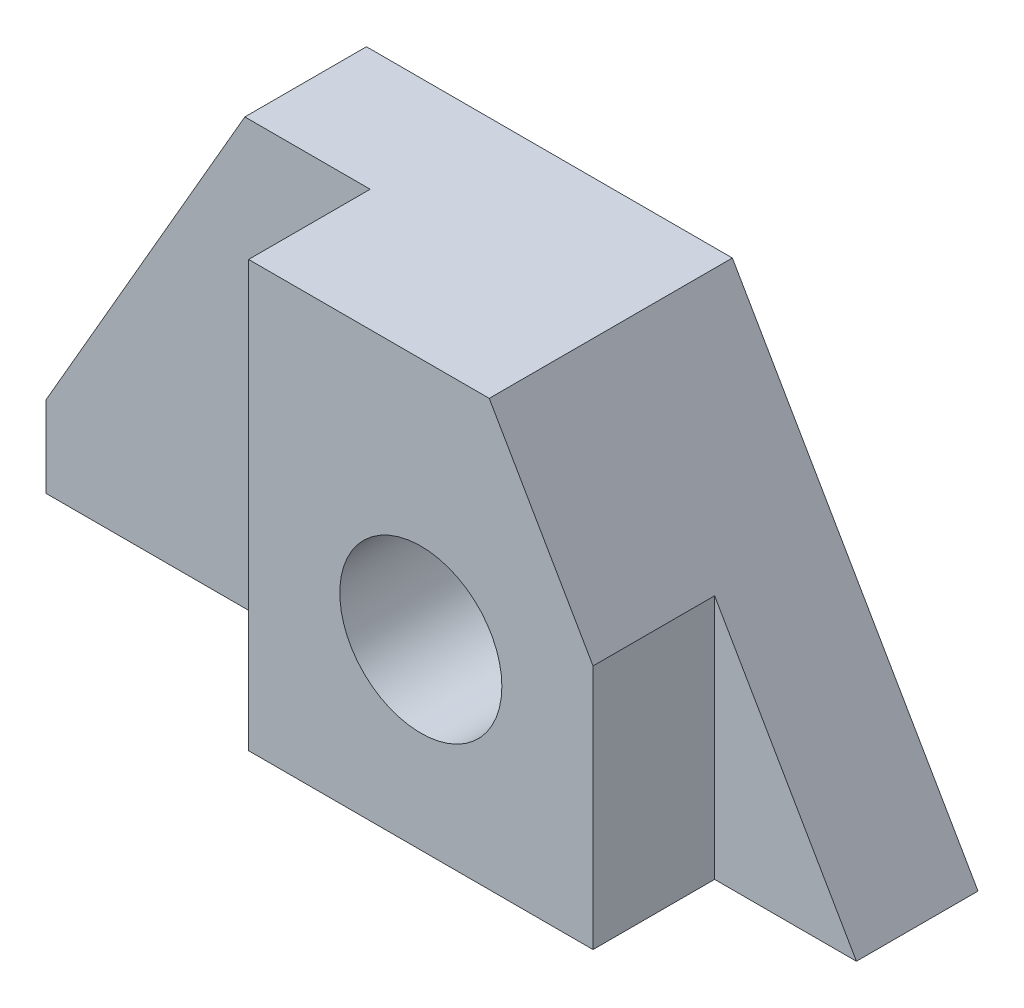
ISO-10303-21;
HEADER;
FILE_DESCRIPTION(('STEP AP214'),'2;1');
FILE_NAME('part.step','',(''),(''),'','','');
FILE_SCHEMA(('AUTOMOTIVE_DESIGN { 1 0 10303 214 1 1 1 1 }'));
ENDSEC;
DATA;
#1=APPLICATION_CONTEXT('core data for automotive mechanical design processes');
#2=APPLICATION_PROTOCOL_DEFINITION('international standard','automotive_design',2000,#1);
#3=PRODUCT_CONTEXT('',#1,'mechanical');
#4=PRODUCT('Part','Part','',(#3));
#5=PRODUCT_RELATED_PRODUCT_CATEGORY('part','',(#4));
#6=PRODUCT_DEFINITION_FORMATION('','',#4);
#7=PRODUCT_DEFINITION_CONTEXT('part definition',#1,'design');
#8=PRODUCT_DEFINITION('design','',#6,#7);
#9=PRODUCT_DEFINITION_SHAPE('','',#8);
#10=(LENGTH_UNIT() NAMED_UNIT(*) SI_UNIT(.MILLI.,.METRE.));
#11=(NAMED_UNIT(*) PLANE_ANGLE_UNIT() SI_UNIT($,.RADIAN.));
#12=(NAMED_UNIT(*) SI_UNIT($,.STERADIAN.) SOLID_ANGLE_UNIT());
#13=UNCERTAINTY_MEASURE_WITH_UNIT(LENGTH_MEASURE(1.E-05),#10,'distance_accuracy_value','');
#14=(GEOMETRIC_REPRESENTATION_CONTEXT(3) GLOBAL_UNCERTAINTY_ASSIGNED_CONTEXT((#13)) GLOBAL_UNIT_ASSIGNED_CONTEXT((#10,
#11,#12)) REPRESENTATION_CONTEXT('',''));
#15=CARTESIAN_POINT('',(0.,0.,0.));
#16=DIRECTION('',(0.,0.,1.));
#17=DIRECTION('',(1.,0.,0.));
#18=AXIS2_PLACEMENT_3D('',#15,#16,#17);
#19=CARTESIAN_POINT('',(0.,66.675,19.05));
#20=DIRECTION('',(0.,-1.,0.));
#21=DIRECTION('',(0.,0.,-1.));
#22=AXIS2_PLACEMENT_3D('',#19,#20,#21);
#23=PLANE('',#22);
#24=DIRECTION('',(-1.,0.,0.));
#25=VECTOR('',#24,1.);
#26=CARTESIAN_POINT('',(0.,66.675,0.));
#27=LINE('',#26,#25);
#28=CARTESIAN_POINT('',(-0.79606103391627,66.675,0.));
#29=VERTEX_POINT('',#28);
#30=CARTESIAN_POINT('',(-58.1387510561882,66.675,0.));
#31=VERTEX_POINT('',#30);
#32=EDGE_CURVE('E196',#29,#31,#27,.T.);
#33=ORIENTED_EDGE('',*,*,#32,.T.);
#34=DIRECTION('',(0.,0.,-1.));
#35=VECTOR('',#34,1.);
#36=CARTESIAN_POINT('',(-58.1387510561882,66.675,19.05));
#37=LINE('',#36,#35);
#38=CARTESIAN_POINT('',(-58.1387510561882,66.675,19.05));
#39=VERTEX_POINT('',#38);
#40=EDGE_CURVE('E11',#39,#31,#37,.T.);
#41=ORIENTED_EDGE('',*,*,#40,.F.);
#42=DIRECTION('',(-1.,0.,0.));
#43=VECTOR('',#42,1.);
#44=CARTESIAN_POINT('',(0.,66.675,19.05));
#45=LINE('',#44,#43);
#46=CARTESIAN_POINT('',(-38.5012318356978,66.675,19.05));
#47=VERTEX_POINT('',#46);
#48=EDGE_CURVE('E95',#47,#39,#45,.T.);
#49=ORIENTED_EDGE('',*,*,#48,.F.);
#50=DIRECTION('',(0.,0.,-1.));
#51=VECTOR('',#50,1.);
#52=CARTESIAN_POINT('',(-38.5012318356978,66.675,38.1));
#53=LINE('',#52,#51);
#54=CARTESIAN_POINT('',(-38.5012318356978,66.675,38.1));
#55=VERTEX_POINT('',#54);
#56=EDGE_CURVE('E185',#55,#47,#53,.T.);
#57=ORIENTED_EDGE('',*,*,#56,.F.);
#58=DIRECTION('',(-1.,0.,0.));
#59=VECTOR('',#58,1.);
#60=CARTESIAN_POINT('',(0.,66.675,38.1));
#61=LINE('',#60,#59);
#62=CARTESIAN_POINT('',(-0.79606103391627,66.675,38.1));
#63=VERTEX_POINT('',#62);
#64=EDGE_CURVE('E166',#63,#55,#61,.T.);
#65=ORIENTED_EDGE('',*,*,#64,.F.);
#66=DIRECTION('',(0.,0.,-1.));
#67=VECTOR('',#66,1.);
#68=CARTESIAN_POINT('',(-0.79606103391627,66.675,38.1));
#69=LINE('',#68,#67);
#70=EDGE_CURVE('E189',#63,#29,#69,.T.);
#71=ORIENTED_EDGE('',*,*,#70,.T.);
#72=EDGE_LOOP('',(#33,#41,#49,#57,#65,#71));
#73=FACE_BOUND('',#72,.T.);
#74=ADVANCED_FACE('F45',(#73),#23,.F.);
#75=CARTESIAN_POINT('',(-72.475185190805,41.8435676794787,19.05));
#76=DIRECTION('',(0.866025403784442,-0.499999999999995,0.));
#77=DIRECTION('',(0.499999999999995,0.866025403784442,0.));
#78=AXIS2_PLACEMENT_3D('',#75,#76,#77);
#79=PLANE('',#78);
#80=DIRECTION('',(-0.499999999999995,-0.866025403784442,0.));
#81=VECTOR('',#80,1.);
#82=CARTESIAN_POINT('',(-72.475185190805,41.8435676794787,0.));
#83=LINE('',#82,#81);
#84=CARTESIAN_POINT('',(-89.3012318356978,12.7,0.));
#85=VERTEX_POINT('',#84);
#86=EDGE_CURVE('E215',#31,#85,#83,.T.);
#87=ORIENTED_EDGE('',*,*,#86,.T.);
#88=DIRECTION('',(0.,0.,-1.));
#89=VECTOR('',#88,1.);
#90=CARTESIAN_POINT('',(-89.3012318356978,12.7,19.05));
#91=LINE('',#90,#89);
#92=CARTESIAN_POINT('',(-89.3012318356978,12.7,19.05));
#93=VERTEX_POINT('',#92);
#94=EDGE_CURVE('E53',#93,#85,#91,.T.);
#95=ORIENTED_EDGE('',*,*,#94,.F.);
#96=DIRECTION('',(-0.499999999999995,-0.866025403784442,0.));
#97=VECTOR('',#96,1.);
#98=CARTESIAN_POINT('',(-72.475185190805,41.8435676794787,19.05));
#99=LINE('',#98,#97);
#100=EDGE_CURVE('E204',#39,#93,#99,.T.);
#101=ORIENTED_EDGE('',*,*,#100,.F.);
#102=ORIENTED_EDGE('',*,*,#40,.T.);
#103=EDGE_LOOP('',(#87,#95,#101,#102));
#104=FACE_BOUND('',#103,.T.);
#105=ADVANCED_FACE('F245',(#104),#79,.F.);
#106=CARTESIAN_POINT('',(-89.3012318356978,0.,19.05));
#107=DIRECTION('',(1.,0.,0.));
#108=DIRECTION('',(0.,0.,-1.));
#109=AXIS2_PLACEMENT_3D('',#106,#107,#108);
#110=PLANE('',#109);
#111=DIRECTION('',(0.,-1.,0.));
#112=VECTOR('',#111,1.);
#113=CARTESIAN_POINT('',(-89.3012318356978,0.,0.));
#114=LINE('',#113,#112);
#115=CARTESIAN_POINT('',(-89.3012318356978,0.,0.));
#116=VERTEX_POINT('',#115);
#117=EDGE_CURVE('E87',#85,#116,#114,.T.);
#118=ORIENTED_EDGE('',*,*,#117,.T.);
#119=DIRECTION('',(0.,0.,-1.));
#120=VECTOR('',#119,1.);
#121=CARTESIAN_POINT('',(-89.3012318356978,0.,19.05));
#122=LINE('',#121,#120);
#123=CARTESIAN_POINT('',(-89.3012318356978,0.,19.05));
#124=VERTEX_POINT('',#123);
#125=EDGE_CURVE('E212',#124,#116,#122,.T.);
#126=ORIENTED_EDGE('',*,*,#125,.F.);
#127=DIRECTION('',(0.,-1.,0.));
#128=VECTOR('',#127,1.);
#129=CARTESIAN_POINT('',(-89.3012318356978,0.,19.05));
#130=LINE('',#129,#128);
#131=EDGE_CURVE('E69',#93,#124,#130,.T.);
#132=ORIENTED_EDGE('',*,*,#131,.F.);
#133=ORIENTED_EDGE('',*,*,#94,.T.);
#134=EDGE_LOOP('',(#118,#126,#132,#133));
#135=FACE_BOUND('',#134,.T.);
#136=ADVANCED_FACE('F225',(#135),#110,.F.);
#137=CARTESIAN_POINT('',(0.,0.,19.05));
#138=DIRECTION('',(0.,1.,0.));
#139=DIRECTION('',(0.,0.,1.));
#140=AXIS2_PLACEMENT_3D('',#137,#138,#139);
#141=PLANE('',#140);
#142=DIRECTION('',(1.,0.,0.));
#143=VECTOR('',#142,1.);
#144=CARTESIAN_POINT('',(0.,0.,0.));
#145=LINE('',#144,#143);
#146=CARTESIAN_POINT('',(37.6987681643022,0.,0.));
#147=VERTEX_POINT('',#146);
#148=EDGE_CURVE('E201',#116,#147,#145,.T.);
#149=ORIENTED_EDGE('',*,*,#148,.T.);
#150=DIRECTION('',(0.,0.,-1.));
#151=VECTOR('',#150,1.);
#152=CARTESIAN_POINT('',(37.6987681643022,0.,19.05));
#153=LINE('',#152,#151);
#154=CARTESIAN_POINT('',(37.6987681643022,0.,19.05));
#155=VERTEX_POINT('',#154);
#156=EDGE_CURVE('E147',#155,#147,#153,.T.);
#157=ORIENTED_EDGE('',*,*,#156,.F.);
#158=DIRECTION('',(1.,0.,0.));
#159=VECTOR('',#158,1.);
#160=CARTESIAN_POINT('',(0.,0.,19.05));
#161=LINE('',#160,#159);
#162=CARTESIAN_POINT('',(15.4737681643022,0.,19.05));
#163=VERTEX_POINT('',#162);
#164=EDGE_CURVE('E138',#163,#155,#161,.T.);
#165=ORIENTED_EDGE('',*,*,#164,.F.);
#166=DIRECTION('',(0.,0.,-1.));
#167=VECTOR('',#166,1.);
#168=CARTESIAN_POINT('',(15.4737681643022,0.,38.1));
#169=LINE('',#168,#167);
#170=CARTESIAN_POINT('',(15.4737681643022,0.,38.1));
#171=VERTEX_POINT('',#170);
#172=EDGE_CURVE('E125',#171,#163,#169,.T.);
#173=ORIENTED_EDGE('',*,*,#172,.F.);
#174=DIRECTION('',(1.,0.,0.));
#175=VECTOR('',#174,1.);
#176=CARTESIAN_POINT('',(0.,0.,38.1));
#177=LINE('',#176,#175);
#178=CARTESIAN_POINT('',(-38.5012318356978,0.,38.1));
#179=VERTEX_POINT('',#178);
#180=EDGE_CURVE('E133',#179,#171,#177,.T.);
#181=ORIENTED_EDGE('',*,*,#180,.F.);
#182=DIRECTION('',(0.,0.,-1.));
#183=VECTOR('',#182,1.);
#184=CARTESIAN_POINT('',(-38.5012318356978,0.,38.1));
#185=LINE('',#184,#183);
#186=CARTESIAN_POINT('',(-38.5012318356978,0.,19.05));
#187=VERTEX_POINT('',#186);
#188=EDGE_CURVE('E132',#179,#187,#185,.T.);
#189=ORIENTED_EDGE('',*,*,#188,.T.);
#190=DIRECTION('',(1.,0.,0.));
#191=VECTOR('',#190,1.);
#192=CARTESIAN_POINT('',(0.,0.,19.05));
#193=LINE('',#192,#191);
#194=EDGE_CURVE('E209',#124,#187,#193,.T.);
#195=ORIENTED_EDGE('',*,*,#194,.F.);
#196=ORIENTED_EDGE('',*,*,#125,.T.);
#197=EDGE_LOOP('',(#149,#157,#165,#173,#181,#189,#195,#196));
#198=FACE_BOUND('',#197,.T.);
#199=ADVANCED_FACE('F145',(#198),#141,.F.);
#200=CARTESIAN_POINT('',(0.,0.,19.05));
#201=DIRECTION('',(0.,0.,1.));
#202=DIRECTION('',(1.,0.,0.));
#203=AXIS2_PLACEMENT_3D('',#200,#201,#202);
#204=PLANE('',#203);
#205=DIRECTION('',(0.,-1.,0.));
#206=VECTOR('',#205,1.);
#207=CARTESIAN_POINT('',(-38.5012318356978,0.,19.05));
#208=LINE('',#207,#206);
#209=EDGE_CURVE('E197',#47,#187,#208,.T.);
#210=ORIENTED_EDGE('',*,*,#209,.F.);
#211=ORIENTED_EDGE('',*,*,#48,.T.);
#212=ORIENTED_EDGE('',*,*,#100,.T.);
#213=ORIENTED_EDGE('',*,*,#131,.T.);
#214=ORIENTED_EDGE('',*,*,#194,.T.);
#215=EDGE_LOOP('',(#210,#211,#212,#213,#214));
#216=FACE_BOUND('',#215,.T.);
#217=ADVANCED_FACE('F244',(#216),#204,.T.);
#218=CARTESIAN_POINT('',(0.,0.,0.));
#219=DIRECTION('',(0.,0.,1.));
#220=DIRECTION('',(1.,0.,0.));
#221=AXIS2_PLACEMENT_3D('',#218,#219,#220);
#222=PLANE('',#221);
#223=ORIENTED_EDGE('',*,*,#32,.F.);
#224=DIRECTION('',(-0.500000000000001,0.866025403784438,0.));
#225=VECTOR('',#224,1.);
#226=CARTESIAN_POINT('',(28.2740761232266,16.3240454608329,0.));
#227=LINE('',#226,#225);
#228=EDGE_CURVE('E159',#147,#29,#227,.T.);
#229=ORIENTED_EDGE('',*,*,#228,.F.);
#230=ORIENTED_EDGE('',*,*,#148,.F.);
#231=ORIENTED_EDGE('',*,*,#117,.F.);
#232=ORIENTED_EDGE('',*,*,#86,.F.);
#233=EDGE_LOOP('',(#223,#229,#230,#231,#232));
#234=FACE_BOUND('',#233,.T.);
#235=CARTESIAN_POINT('',(-11.5137318356978,28.575,0.));
#236=DIRECTION('',(0.,0.,1.));
#237=DIRECTION('',(1.,0.,0.));
#238=AXIS2_PLACEMENT_3D('',#235,#236,#237);
#239=CIRCLE('',#238,12.7);
#240=CARTESIAN_POINT('',(1.18626816430217,28.575,0.));
#241=VERTEX_POINT('',#240);
#242=EDGE_CURVE('E151',#241,#241,#239,.T.);
#243=ORIENTED_EDGE('',*,*,#242,.T.);
#244=EDGE_LOOP('',(#243));
#245=FACE_BOUND('',#244,.T.);
#246=ADVANCED_FACE('F231',(#234,#245),#222,.F.);
#247=CARTESIAN_POINT('',(-38.5012318356978,0.,38.1));
#248=DIRECTION('',(1.,0.,0.));
#249=DIRECTION('',(0.,1.,0.));
#250=AXIS2_PLACEMENT_3D('',#247,#248,#249);
#251=PLANE('',#250);
#252=ORIENTED_EDGE('',*,*,#56,.T.);
#253=ORIENTED_EDGE('',*,*,#209,.T.);
#254=ORIENTED_EDGE('',*,*,#188,.F.);
#255=DIRECTION('',(0.,-1.,0.));
#256=VECTOR('',#255,1.);
#257=CARTESIAN_POINT('',(-38.5012318356978,0.,38.1));
#258=LINE('',#257,#256);
#259=EDGE_CURVE('E170',#55,#179,#258,.T.);
#260=ORIENTED_EDGE('',*,*,#259,.F.);
#261=EDGE_LOOP('',(#252,#253,#254,#260));
#262=FACE_BOUND('',#261,.T.);
#263=ADVANCED_FACE('F243',(#262),#251,.F.);
#264=CARTESIAN_POINT('',(15.4737681643022,0.,38.1));
#265=DIRECTION('',(1.,0.,0.));
#266=DIRECTION('',(0.,0.,-1.));
#267=AXIS2_PLACEMENT_3D('',#264,#265,#266);
#268=PLANE('',#267);
#269=DIRECTION('',(0.,-1.,0.));
#270=VECTOR('',#269,1.);
#271=CARTESIAN_POINT('',(15.4737681643022,0.,19.05));
#272=LINE('',#271,#270);
#273=CARTESIAN_POINT('',(15.4737681643022,38.4948291982182,19.05));
#274=VERTEX_POINT('',#273);
#275=EDGE_CURVE('E60',#274,#163,#272,.T.);
#276=ORIENTED_EDGE('',*,*,#275,.F.);
#277=DIRECTION('',(0.,0.,-1.));
#278=VECTOR('',#277,1.);
#279=CARTESIAN_POINT('',(15.4737681643022,38.4948291982182,38.1));
#280=LINE('',#279,#278);
#281=CARTESIAN_POINT('',(15.4737681643022,38.4948291982182,38.1));
#282=VERTEX_POINT('',#281);
#283=EDGE_CURVE('E193',#282,#274,#280,.T.);
#284=ORIENTED_EDGE('',*,*,#283,.F.);
#285=DIRECTION('',(0.,-1.,0.));
#286=VECTOR('',#285,1.);
#287=CARTESIAN_POINT('',(15.4737681643022,0.,38.1));
#288=LINE('',#287,#286);
#289=EDGE_CURVE('E128',#282,#171,#288,.T.);
#290=ORIENTED_EDGE('',*,*,#289,.T.);
#291=ORIENTED_EDGE('',*,*,#172,.T.);
#292=EDGE_LOOP('',(#276,#284,#290,#291));
#293=FACE_BOUND('',#292,.T.);
#294=ADVANCED_FACE('F126',(#293),#268,.T.);
#295=CARTESIAN_POINT('',(28.2740761232266,16.3240454608329,38.1));
#296=DIRECTION('',(-0.866025403784438,-0.500000000000001,0.));
#297=DIRECTION('',(0.500000000000001,-0.866025403784438,0.));
#298=AXIS2_PLACEMENT_3D('',#295,#296,#297);
#299=PLANE('',#298);
#300=ORIENTED_EDGE('',*,*,#228,.T.);
#301=ORIENTED_EDGE('',*,*,#70,.F.);
#302=DIRECTION('',(-0.500000000000001,0.866025403784438,0.));
#303=VECTOR('',#302,1.);
#304=CARTESIAN_POINT('',(28.2740761232266,16.3240454608329,38.1));
#305=LINE('',#304,#303);
#306=EDGE_CURVE('E162',#282,#63,#305,.T.);
#307=ORIENTED_EDGE('',*,*,#306,.F.);
#308=ORIENTED_EDGE('',*,*,#283,.T.);
#309=DIRECTION('',(-0.500000000000001,0.866025403784438,0.));
#310=VECTOR('',#309,1.);
#311=CARTESIAN_POINT('',(28.2740761232266,16.3240454608329,19.05));
#312=LINE('',#311,#310);
#313=EDGE_CURVE('E141',#155,#274,#312,.T.);
#314=ORIENTED_EDGE('',*,*,#313,.F.);
#315=ORIENTED_EDGE('',*,*,#156,.T.);
#316=EDGE_LOOP('',(#300,#301,#307,#308,#314,#315));
#317=FACE_BOUND('',#316,.T.);
#318=ADVANCED_FACE('F235',(#317),#299,.F.);
#319=CARTESIAN_POINT('',(-11.5137318356978,28.575,38.1));
#320=DIRECTION('',(0.,0.,-1.));
#321=DIRECTION('',(-1.,0.,0.));
#322=AXIS2_PLACEMENT_3D('',#319,#320,#321);
#323=CYLINDRICAL_SURFACE('',#322,12.7);
#324=CARTESIAN_POINT('',(-11.5137318356978,28.575,38.1));
#325=DIRECTION('',(0.,0.,1.));
#326=DIRECTION('',(1.,0.,0.));
#327=AXIS2_PLACEMENT_3D('',#324,#325,#326);
#328=CIRCLE('',#327,12.7);
#329=CARTESIAN_POINT('',(1.18626816430217,28.575,38.1));
#330=VERTEX_POINT('',#329);
#331=EDGE_CURVE('E155',#330,#330,#328,.T.);
#332=ORIENTED_EDGE('',*,*,#331,.T.);
#333=EDGE_LOOP('',(#332));
#334=FACE_BOUND('',#333,.T.);
#335=ORIENTED_EDGE('',*,*,#242,.F.);
#336=EDGE_LOOP('',(#335));
#337=FACE_BOUND('',#336,.T.);
#338=ADVANCED_FACE('F259',(#334,#337),#323,.F.);
#339=CARTESIAN_POINT('',(0.,0.,38.1));
#340=DIRECTION('',(0.,0.,1.));
#341=DIRECTION('',(1.,0.,0.));
#342=AXIS2_PLACEMENT_3D('',#339,#340,#341);
#343=PLANE('',#342);
#344=ORIENTED_EDGE('',*,*,#331,.F.);
#345=EDGE_LOOP('',(#344));
#346=FACE_BOUND('',#345,.T.);
#347=ORIENTED_EDGE('',*,*,#289,.F.);
#348=ORIENTED_EDGE('',*,*,#306,.T.);
#349=ORIENTED_EDGE('',*,*,#64,.T.);
#350=ORIENTED_EDGE('',*,*,#259,.T.);
#351=ORIENTED_EDGE('',*,*,#180,.T.);
#352=EDGE_LOOP('',(#347,#348,#349,#350,#351));
#353=FACE_BOUND('',#352,.T.);
#354=ADVANCED_FACE('F240',(#346,#353),#343,.T.);
#355=CARTESIAN_POINT('',(0.,0.,19.05));
#356=DIRECTION('',(0.,0.,1.));
#357=DIRECTION('',(1.,0.,0.));
#358=AXIS2_PLACEMENT_3D('',#355,#356,#357);
#359=PLANE('',#358);
#360=ORIENTED_EDGE('',*,*,#313,.T.);
#361=ORIENTED_EDGE('',*,*,#275,.T.);
#362=ORIENTED_EDGE('',*,*,#164,.T.);
#363=EDGE_LOOP('',(#360,#361,#362));
#364=FACE_BOUND('',#363,.T.);
#365=ADVANCED_FACE('F137',(#364),#359,.T.);
#366=CLOSED_SHELL('',(#74,#105,#136,#199,#217,#246,#263,#294,#318,#338,#354,#365));
#367=MANIFOLD_SOLID_BREP('B2',#366);
#368=ADVANCED_BREP_SHAPE_REPRESENTATION('',(#18,#367),#14);
#369=SHAPE_DEFINITION_REPRESENTATION(#9,#368);
ENDSEC;
END-ISO-10303-21;
